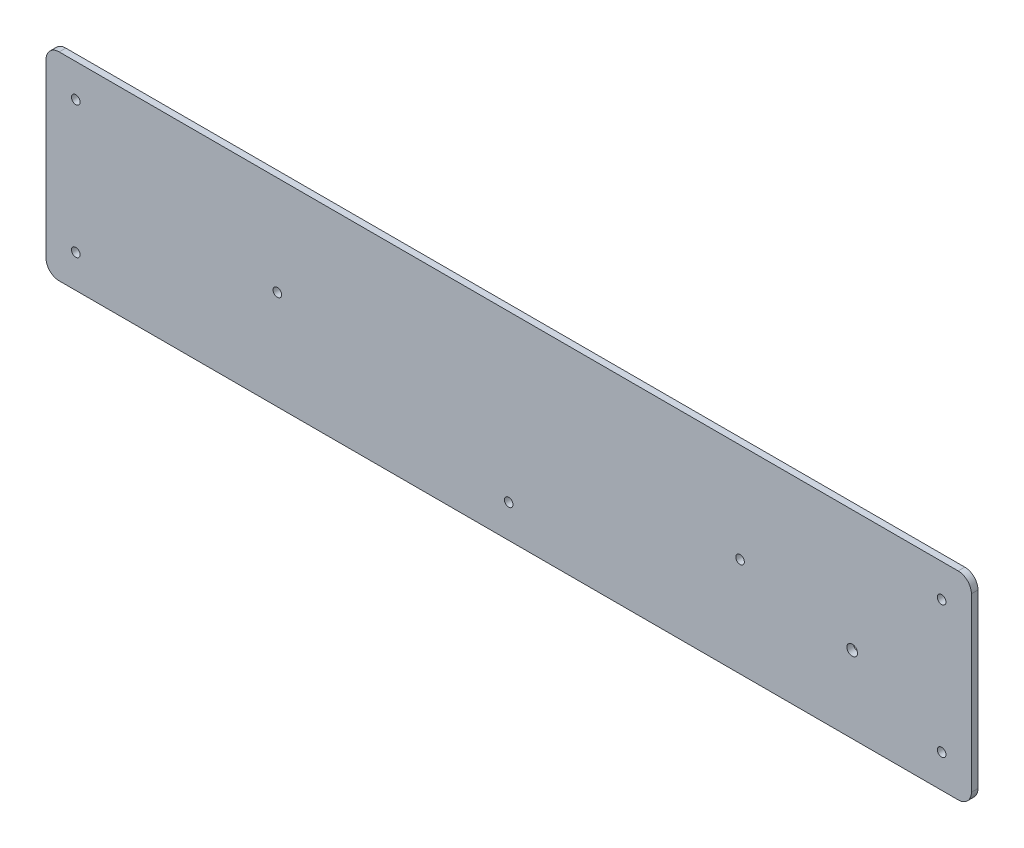
ISO-10303-21;
HEADER;
FILE_DESCRIPTION(('STEP AP214'),'2;1');
FILE_NAME('part.step','',(''),(''),'','','');
FILE_SCHEMA(('AUTOMOTIVE_DESIGN { 1 0 10303 214 1 1 1 1 }'));
ENDSEC;
DATA;
#1=APPLICATION_CONTEXT('core data for automotive mechanical design processes');
#2=APPLICATION_PROTOCOL_DEFINITION('international standard','automotive_design',2000,#1);
#3=PRODUCT_CONTEXT('',#1,'mechanical');
#4=PRODUCT('Part','Part','',(#3));
#5=PRODUCT_RELATED_PRODUCT_CATEGORY('part','',(#4));
#6=PRODUCT_DEFINITION_FORMATION('','',#4);
#7=PRODUCT_DEFINITION_CONTEXT('part definition',#1,'design');
#8=PRODUCT_DEFINITION('design','',#6,#7);
#9=PRODUCT_DEFINITION_SHAPE('','',#8);
#10=(LENGTH_UNIT() NAMED_UNIT(*) SI_UNIT(.MILLI.,.METRE.));
#11=(NAMED_UNIT(*) PLANE_ANGLE_UNIT() SI_UNIT($,.RADIAN.));
#12=(NAMED_UNIT(*) SI_UNIT($,.STERADIAN.) SOLID_ANGLE_UNIT());
#13=UNCERTAINTY_MEASURE_WITH_UNIT(LENGTH_MEASURE(1.E-05),#10,'distance_accuracy_value','');
#14=(GEOMETRIC_REPRESENTATION_CONTEXT(3) GLOBAL_UNCERTAINTY_ASSIGNED_CONTEXT((#13)) GLOBAL_UNIT_ASSIGNED_CONTEXT((#10,
#11,#12)) REPRESENTATION_CONTEXT('',''));
#15=CARTESIAN_POINT('',(0.,0.,0.));
#16=DIRECTION('',(0.,0.,1.));
#17=DIRECTION('',(1.,0.,0.));
#18=AXIS2_PLACEMENT_3D('',#15,#16,#17);
#19=CARTESIAN_POINT('',(350.,75.,5.));
#20=DIRECTION('',(-1.,0.,0.));
#21=DIRECTION('',(0.,0.,1.));
#22=AXIS2_PLACEMENT_3D('',#19,#20,#21);
#23=PLANE('',#22);
#24=DIRECTION('',(0.,1.,0.));
#25=VECTOR('',#24,1.);
#26=CARTESIAN_POINT('',(350.,75.,5.));
#27=LINE('',#26,#25);
#28=CARTESIAN_POINT('',(350.,-65.0000000000001,5.));
#29=VERTEX_POINT('',#28);
#30=CARTESIAN_POINT('',(350.,65.,5.));
#31=VERTEX_POINT('',#30);
#32=EDGE_CURVE('E135',#29,#31,#27,.T.);
#33=ORIENTED_EDGE('',*,*,#32,.F.);
#34=DIRECTION('',(0.,0.,-1.));
#35=VECTOR('',#34,1.);
#36=CARTESIAN_POINT('',(350.,-65.0000000000001,5.));
#37=LINE('',#36,#35);
#38=CARTESIAN_POINT('',(350.,-65.0000000000001,0.));
#39=VERTEX_POINT('',#38);
#40=EDGE_CURVE('E11',#29,#39,#37,.T.);
#41=ORIENTED_EDGE('',*,*,#40,.T.);
#42=DIRECTION('',(0.,1.,0.));
#43=VECTOR('',#42,1.);
#44=CARTESIAN_POINT('',(350.,75.,0.));
#45=LINE('',#44,#43);
#46=CARTESIAN_POINT('',(350.,65.,0.));
#47=VERTEX_POINT('',#46);
#48=EDGE_CURVE('E183',#39,#47,#45,.T.);
#49=ORIENTED_EDGE('',*,*,#48,.T.);
#50=DIRECTION('',(0.,0.,-1.));
#51=VECTOR('',#50,1.);
#52=CARTESIAN_POINT('',(350.,65.,5.));
#53=LINE('',#52,#51);
#54=EDGE_CURVE('E48',#47,#31,#53,.F.);
#55=ORIENTED_EDGE('',*,*,#54,.T.);
#56=EDGE_LOOP('',(#33,#41,#49,#55));
#57=FACE_BOUND('',#56,.T.);
#58=ADVANCED_FACE('F39',(#57),#23,.F.);
#59=CARTESIAN_POINT('',(-350.,75.,5.));
#60=DIRECTION('',(0.,-1.,0.));
#61=DIRECTION('',(0.,0.,-1.));
#62=AXIS2_PLACEMENT_3D('',#59,#60,#61);
#63=PLANE('',#62);
#64=DIRECTION('',(-1.,0.,0.));
#65=VECTOR('',#64,1.);
#66=CARTESIAN_POINT('',(-350.,75.,0.));
#67=LINE('',#66,#65);
#68=CARTESIAN_POINT('',(340.,75.,0.));
#69=VERTEX_POINT('',#68);
#70=CARTESIAN_POINT('',(-340.,75.,0.));
#71=VERTEX_POINT('',#70);
#72=EDGE_CURVE('E140',#69,#71,#67,.T.);
#73=ORIENTED_EDGE('',*,*,#72,.T.);
#74=DIRECTION('',(0.,0.,-1.));
#75=VECTOR('',#74,1.);
#76=CARTESIAN_POINT('',(-340.,75.,5.));
#77=LINE('',#76,#75);
#78=CARTESIAN_POINT('',(-340.,75.,5.));
#79=VERTEX_POINT('',#78);
#80=EDGE_CURVE('E56',#71,#79,#77,.F.);
#81=ORIENTED_EDGE('',*,*,#80,.T.);
#82=DIRECTION('',(-1.,0.,0.));
#83=VECTOR('',#82,1.);
#84=CARTESIAN_POINT('',(-350.,75.,5.));
#85=LINE('',#84,#83);
#86=CARTESIAN_POINT('',(340.,75.,5.));
#87=VERTEX_POINT('',#86);
#88=EDGE_CURVE('E138',#87,#79,#85,.T.);
#89=ORIENTED_EDGE('',*,*,#88,.F.);
#90=DIRECTION('',(0.,0.,-1.));
#91=VECTOR('',#90,1.);
#92=CARTESIAN_POINT('',(340.,75.,5.));
#93=LINE('',#92,#91);
#94=EDGE_CURVE('E158',#87,#69,#93,.T.);
#95=ORIENTED_EDGE('',*,*,#94,.T.);
#96=EDGE_LOOP('',(#73,#81,#89,#95));
#97=FACE_BOUND('',#96,.T.);
#98=ADVANCED_FACE('F237',(#97),#63,.F.);
#99=CARTESIAN_POINT('',(-350.,75.,5.));
#100=DIRECTION('',(1.,0.,0.));
#101=DIRECTION('',(0.,0.,-1.));
#102=AXIS2_PLACEMENT_3D('',#99,#100,#101);
#103=PLANE('',#102);
#104=DIRECTION('',(0.,-1.,0.));
#105=VECTOR('',#104,1.);
#106=CARTESIAN_POINT('',(-350.,75.,0.));
#107=LINE('',#106,#105);
#108=CARTESIAN_POINT('',(-350.,65.,0.));
#109=VERTEX_POINT('',#108);
#110=CARTESIAN_POINT('',(-350.,-65.0000000000001,0.));
#111=VERTEX_POINT('',#110);
#112=EDGE_CURVE('E136',#109,#111,#107,.T.);
#113=ORIENTED_EDGE('',*,*,#112,.T.);
#114=DIRECTION('',(0.,0.,-1.));
#115=VECTOR('',#114,1.);
#116=CARTESIAN_POINT('',(-350.,-65.0000000000001,5.));
#117=LINE('',#116,#115);
#118=CARTESIAN_POINT('',(-350.,-65.0000000000001,5.));
#119=VERTEX_POINT('',#118);
#120=EDGE_CURVE('E113',#111,#119,#117,.F.);
#121=ORIENTED_EDGE('',*,*,#120,.T.);
#122=DIRECTION('',(0.,-1.,0.));
#123=VECTOR('',#122,1.);
#124=CARTESIAN_POINT('',(-350.,75.,5.));
#125=LINE('',#124,#123);
#126=CARTESIAN_POINT('',(-350.,65.,5.));
#127=VERTEX_POINT('',#126);
#128=EDGE_CURVE('E192',#127,#119,#125,.T.);
#129=ORIENTED_EDGE('',*,*,#128,.F.);
#130=DIRECTION('',(0.,0.,-1.));
#131=VECTOR('',#130,1.);
#132=CARTESIAN_POINT('',(-350.,65.,5.));
#133=LINE('',#132,#131);
#134=EDGE_CURVE('E118',#127,#109,#133,.T.);
#135=ORIENTED_EDGE('',*,*,#134,.T.);
#136=EDGE_LOOP('',(#113,#121,#129,#135));
#137=FACE_BOUND('',#136,.T.);
#138=ADVANCED_FACE('F242',(#137),#103,.F.);
#139=CARTESIAN_POINT('',(-350.,-75.,5.));
#140=DIRECTION('',(0.,1.,0.));
#141=DIRECTION('',(0.,0.,1.));
#142=AXIS2_PLACEMENT_3D('',#139,#140,#141);
#143=PLANE('',#142);
#144=DIRECTION('',(1.,0.,0.));
#145=VECTOR('',#144,1.);
#146=CARTESIAN_POINT('',(-350.,-75.,5.));
#147=LINE('',#146,#145);
#148=CARTESIAN_POINT('',(-340.,-75.,5.));
#149=VERTEX_POINT('',#148);
#150=CARTESIAN_POINT('',(340.,-75.,5.));
#151=VERTEX_POINT('',#150);
#152=EDGE_CURVE('E128',#149,#151,#147,.T.);
#153=ORIENTED_EDGE('',*,*,#152,.F.);
#154=DIRECTION('',(0.,0.,-1.));
#155=VECTOR('',#154,1.);
#156=CARTESIAN_POINT('',(-340.,-75.,5.));
#157=LINE('',#156,#155);
#158=CARTESIAN_POINT('',(-340.,-75.,0.));
#159=VERTEX_POINT('',#158);
#160=EDGE_CURVE('E112',#149,#159,#157,.T.);
#161=ORIENTED_EDGE('',*,*,#160,.T.);
#162=DIRECTION('',(1.,0.,0.));
#163=VECTOR('',#162,1.);
#164=CARTESIAN_POINT('',(-350.,-75.,0.));
#165=LINE('',#164,#163);
#166=CARTESIAN_POINT('',(340.,-75.,0.));
#167=VERTEX_POINT('',#166);
#168=EDGE_CURVE('E125',#159,#167,#165,.T.);
#169=ORIENTED_EDGE('',*,*,#168,.T.);
#170=DIRECTION('',(0.,0.,-1.));
#171=VECTOR('',#170,1.);
#172=CARTESIAN_POINT('',(340.,-75.,5.));
#173=LINE('',#172,#171);
#174=EDGE_CURVE('E130',#167,#151,#173,.F.);
#175=ORIENTED_EDGE('',*,*,#174,.T.);
#176=EDGE_LOOP('',(#153,#161,#169,#175));
#177=FACE_BOUND('',#176,.T.);
#178=ADVANCED_FACE('F124',(#177),#143,.F.);
#179=CARTESIAN_POINT('',(0.,0.,5.));
#180=DIRECTION('',(0.,0.,1.));
#181=DIRECTION('',(1.,0.,0.));
#182=AXIS2_PLACEMENT_3D('',#179,#180,#181);
#183=PLANE('',#182);
#184=CARTESIAN_POINT('',(259.827830126626,-16.9623613724783,5.));
#185=DIRECTION('',(0.,0.,1.));
#186=DIRECTION('',(1.,0.,0.));
#187=AXIS2_PLACEMENT_3D('',#184,#185,#186);
#188=CIRCLE('',#187,4.00000000008923);
#189=CARTESIAN_POINT('',(263.827830126716,-16.9623613724783,5.));
#190=VERTEX_POINT('',#189);
#191=EDGE_CURVE('E216',#190,#190,#188,.T.);
#192=ORIENTED_EDGE('',*,*,#191,.F.);
#193=EDGE_LOOP('',(#192));
#194=FACE_BOUND('',#193,.T.);
#195=CARTESIAN_POINT('',(-327.483802203545,-50.,5.));
#196=DIRECTION('',(0.,0.,1.));
#197=DIRECTION('',(1.,0.,0.));
#198=AXIS2_PLACEMENT_3D('',#195,#196,#197);
#199=CIRCLE('',#198,3.24999999999995);
#200=CARTESIAN_POINT('',(-324.233802203545,-50.,5.));
#201=VERTEX_POINT('',#200);
#202=EDGE_CURVE('E198',#201,#201,#199,.T.);
#203=ORIENTED_EDGE('',*,*,#202,.F.);
#204=EDGE_LOOP('',(#203));
#205=FACE_BOUND('',#204,.T.);
#206=CARTESIAN_POINT('',(327.483802203545,-50.,5.));
#207=DIRECTION('',(0.,0.,1.));
#208=DIRECTION('',(-1.,0.,0.));
#209=AXIS2_PLACEMENT_3D('',#206,#207,#208);
#210=CIRCLE('',#209,3.24999999999995);
#211=CARTESIAN_POINT('',(324.233802203545,-50.,5.));
#212=VERTEX_POINT('',#211);
#213=EDGE_CURVE('E206',#212,#212,#210,.T.);
#214=ORIENTED_EDGE('',*,*,#213,.F.);
#215=EDGE_LOOP('',(#214));
#216=FACE_BOUND('',#215,.T.);
#217=CARTESIAN_POINT('',(-327.483802203545,50.,5.));
#218=DIRECTION('',(0.,0.,1.));
#219=DIRECTION('',(-1.,0.,0.));
#220=AXIS2_PLACEMENT_3D('',#217,#218,#219);
#221=CIRCLE('',#220,3.24999999999995);
#222=CARTESIAN_POINT('',(-330.733802203545,50.,5.));
#223=VERTEX_POINT('',#222);
#224=EDGE_CURVE('E202',#223,#223,#221,.T.);
#225=ORIENTED_EDGE('',*,*,#224,.F.);
#226=EDGE_LOOP('',(#225));
#227=FACE_BOUND('',#226,.T.);
#228=CARTESIAN_POINT('',(175.,0.,5.));
#229=DIRECTION('',(0.,0.,1.));
#230=DIRECTION('',(-1.,0.,0.));
#231=AXIS2_PLACEMENT_3D('',#228,#229,#230);
#232=CIRCLE('',#231,3.25000000000001);
#233=CARTESIAN_POINT('',(171.75,0.,5.));
#234=VERTEX_POINT('',#233);
#235=EDGE_CURVE('E199',#234,#234,#232,.T.);
#236=ORIENTED_EDGE('',*,*,#235,.F.);
#237=EDGE_LOOP('',(#236));
#238=FACE_BOUND('',#237,.T.);
#239=CARTESIAN_POINT('',(-175.,0.,5.));
#240=DIRECTION('',(0.,0.,1.));
#241=DIRECTION('',(1.,0.,0.));
#242=AXIS2_PLACEMENT_3D('',#239,#240,#241);
#243=CIRCLE('',#242,3.25000000000001);
#244=CARTESIAN_POINT('',(-171.75,0.,5.));
#245=VERTEX_POINT('',#244);
#246=EDGE_CURVE('E203',#245,#245,#243,.T.);
#247=ORIENTED_EDGE('',*,*,#246,.F.);
#248=EDGE_LOOP('',(#247));
#249=FACE_BOUND('',#248,.T.);
#250=CARTESIAN_POINT('',(327.483802203545,50.,5.));
#251=DIRECTION('',(0.,0.,1.));
#252=DIRECTION('',(1.,0.,0.));
#253=AXIS2_PLACEMENT_3D('',#250,#251,#252);
#254=CIRCLE('',#253,3.24999999999995);
#255=CARTESIAN_POINT('',(330.733802203545,50.,5.));
#256=VERTEX_POINT('',#255);
#257=EDGE_CURVE('E211',#256,#256,#254,.T.);
#258=ORIENTED_EDGE('',*,*,#257,.F.);
#259=EDGE_LOOP('',(#258));
#260=FACE_BOUND('',#259,.T.);
#261=CARTESIAN_POINT('',(-2.22044604925031E-13,-50.,5.));
#262=DIRECTION('',(0.,0.,1.));
#263=DIRECTION('',(1.,0.,0.));
#264=AXIS2_PLACEMENT_3D('',#261,#262,#263);
#265=CIRCLE('',#264,3.25);
#266=CARTESIAN_POINT('',(3.24999999999978,-50.,5.));
#267=VERTEX_POINT('',#266);
#268=EDGE_CURVE('E167',#267,#267,#265,.T.);
#269=ORIENTED_EDGE('',*,*,#268,.F.);
#270=EDGE_LOOP('',(#269));
#271=FACE_BOUND('',#270,.T.);
#272=ORIENTED_EDGE('',*,*,#128,.T.);
#273=CARTESIAN_POINT('',(-340.,-65.,5.));
#274=DIRECTION('',(0.,0.,1.));
#275=DIRECTION('',(1.,0.,0.));
#276=AXIS2_PLACEMENT_3D('',#273,#274,#275);
#277=CIRCLE('',#276,10.);
#278=EDGE_CURVE('E156',#119,#149,#277,.T.);
#279=ORIENTED_EDGE('',*,*,#278,.T.);
#280=ORIENTED_EDGE('',*,*,#152,.T.);
#281=CARTESIAN_POINT('',(340.,-65.0000000000001,5.));
#282=DIRECTION('',(0.,0.,1.));
#283=DIRECTION('',(1.,0.,0.));
#284=AXIS2_PLACEMENT_3D('',#281,#282,#283);
#285=CIRCLE('',#284,10.);
#286=EDGE_CURVE('E152',#151,#29,#285,.T.);
#287=ORIENTED_EDGE('',*,*,#286,.T.);
#288=ORIENTED_EDGE('',*,*,#32,.T.);
#289=CARTESIAN_POINT('',(340.,65.,5.));
#290=DIRECTION('',(0.,0.,1.));
#291=DIRECTION('',(1.,0.,0.));
#292=AXIS2_PLACEMENT_3D('',#289,#290,#291);
#293=CIRCLE('',#292,10.);
#294=EDGE_CURVE('E63',#31,#87,#293,.T.);
#295=ORIENTED_EDGE('',*,*,#294,.T.);
#296=ORIENTED_EDGE('',*,*,#88,.T.);
#297=CARTESIAN_POINT('',(-340.,65.,5.));
#298=DIRECTION('',(0.,0.,1.));
#299=DIRECTION('',(1.,0.,0.));
#300=AXIS2_PLACEMENT_3D('',#297,#298,#299);
#301=CIRCLE('',#300,10.);
#302=EDGE_CURVE('E154',#79,#127,#301,.T.);
#303=ORIENTED_EDGE('',*,*,#302,.T.);
#304=EDGE_LOOP('',(#272,#279,#280,#287,#288,#295,#296,#303));
#305=FACE_BOUND('',#304,.T.);
#306=ADVANCED_FACE('F262',(#194,#205,#216,#227,#238,#249,#260,#271,#305),#183,.T.);
#307=CARTESIAN_POINT('',(0.,0.,0.));
#308=DIRECTION('',(0.,0.,1.));
#309=DIRECTION('',(1.,0.,0.));
#310=AXIS2_PLACEMENT_3D('',#307,#308,#309);
#311=PLANE('',#310);
#312=CARTESIAN_POINT('',(259.827830126626,-16.9623613724783,0.));
#313=DIRECTION('',(0.,0.,1.));
#314=DIRECTION('',(1.,0.,0.));
#315=AXIS2_PLACEMENT_3D('',#312,#313,#314);
#316=CIRCLE('',#315,4.00000000008923);
#317=CARTESIAN_POINT('',(263.827830126716,-16.9623613724783,0.));
#318=VERTEX_POINT('',#317);
#319=EDGE_CURVE('E43',#318,#318,#316,.T.);
#320=ORIENTED_EDGE('',*,*,#319,.T.);
#321=EDGE_LOOP('',(#320));
#322=FACE_BOUND('',#321,.T.);
#323=CARTESIAN_POINT('',(-327.483802203545,-50.,0.));
#324=DIRECTION('',(0.,0.,1.));
#325=DIRECTION('',(1.,0.,0.));
#326=AXIS2_PLACEMENT_3D('',#323,#324,#325);
#327=CIRCLE('',#326,3.24999999999995);
#328=CARTESIAN_POINT('',(-324.233802203545,-50.,0.));
#329=VERTEX_POINT('',#328);
#330=EDGE_CURVE('E181',#329,#329,#327,.T.);
#331=ORIENTED_EDGE('',*,*,#330,.T.);
#332=EDGE_LOOP('',(#331));
#333=FACE_BOUND('',#332,.T.);
#334=CARTESIAN_POINT('',(327.483802203545,-50.,0.));
#335=DIRECTION('',(0.,0.,1.));
#336=DIRECTION('',(1.,0.,0.));
#337=AXIS2_PLACEMENT_3D('',#334,#335,#336);
#338=CIRCLE('',#337,3.24999999999995);
#339=CARTESIAN_POINT('',(330.733802203545,-50.,0.));
#340=VERTEX_POINT('',#339);
#341=EDGE_CURVE('E179',#340,#340,#338,.T.);
#342=ORIENTED_EDGE('',*,*,#341,.T.);
#343=EDGE_LOOP('',(#342));
#344=FACE_BOUND('',#343,.T.);
#345=CARTESIAN_POINT('',(-327.483802203545,50.,0.));
#346=DIRECTION('',(0.,0.,1.));
#347=DIRECTION('',(1.,0.,0.));
#348=AXIS2_PLACEMENT_3D('',#345,#346,#347);
#349=CIRCLE('',#348,3.24999999999995);
#350=CARTESIAN_POINT('',(-324.233802203545,50.,0.));
#351=VERTEX_POINT('',#350);
#352=EDGE_CURVE('E176',#351,#351,#349,.T.);
#353=ORIENTED_EDGE('',*,*,#352,.T.);
#354=EDGE_LOOP('',(#353));
#355=FACE_BOUND('',#354,.T.);
#356=CARTESIAN_POINT('',(175.,0.,0.));
#357=DIRECTION('',(0.,0.,1.));
#358=DIRECTION('',(1.,0.,0.));
#359=AXIS2_PLACEMENT_3D('',#356,#357,#358);
#360=CIRCLE('',#359,3.25000000000001);
#361=CARTESIAN_POINT('',(178.25,0.,0.));
#362=VERTEX_POINT('',#361);
#363=EDGE_CURVE('E173',#362,#362,#360,.T.);
#364=ORIENTED_EDGE('',*,*,#363,.T.);
#365=EDGE_LOOP('',(#364));
#366=FACE_BOUND('',#365,.T.);
#367=CARTESIAN_POINT('',(-175.,0.,0.));
#368=DIRECTION('',(0.,0.,1.));
#369=DIRECTION('',(1.,0.,0.));
#370=AXIS2_PLACEMENT_3D('',#367,#368,#369);
#371=CIRCLE('',#370,3.25000000000001);
#372=CARTESIAN_POINT('',(-171.75,0.,0.));
#373=VERTEX_POINT('',#372);
#374=EDGE_CURVE('E170',#373,#373,#371,.T.);
#375=ORIENTED_EDGE('',*,*,#374,.T.);
#376=EDGE_LOOP('',(#375));
#377=FACE_BOUND('',#376,.T.);
#378=CARTESIAN_POINT('',(327.483802203545,50.,0.));
#379=DIRECTION('',(0.,0.,1.));
#380=DIRECTION('',(1.,0.,0.));
#381=AXIS2_PLACEMENT_3D('',#378,#379,#380);
#382=CIRCLE('',#381,3.24999999999995);
#383=CARTESIAN_POINT('',(330.733802203545,50.,0.));
#384=VERTEX_POINT('',#383);
#385=EDGE_CURVE('E166',#384,#384,#382,.T.);
#386=ORIENTED_EDGE('',*,*,#385,.T.);
#387=EDGE_LOOP('',(#386));
#388=FACE_BOUND('',#387,.T.);
#389=CARTESIAN_POINT('',(-2.22044604925031E-13,-50.,0.));
#390=DIRECTION('',(0.,0.,1.));
#391=DIRECTION('',(1.,0.,0.));
#392=AXIS2_PLACEMENT_3D('',#389,#390,#391);
#393=CIRCLE('',#392,3.25);
#394=CARTESIAN_POINT('',(3.24999999999978,-50.,0.));
#395=VERTEX_POINT('',#394);
#396=EDGE_CURVE('E163',#395,#395,#393,.T.);
#397=ORIENTED_EDGE('',*,*,#396,.T.);
#398=EDGE_LOOP('',(#397));
#399=FACE_BOUND('',#398,.T.);
#400=ORIENTED_EDGE('',*,*,#168,.F.);
#401=CARTESIAN_POINT('',(-340.,-65.,0.));
#402=DIRECTION('',(0.,0.,1.));
#403=DIRECTION('',(1.,0.,0.));
#404=AXIS2_PLACEMENT_3D('',#401,#402,#403);
#405=CIRCLE('',#404,10.);
#406=EDGE_CURVE('E108',#159,#111,#405,.F.);
#407=ORIENTED_EDGE('',*,*,#406,.T.);
#408=ORIENTED_EDGE('',*,*,#112,.F.);
#409=CARTESIAN_POINT('',(-340.,65.,0.));
#410=DIRECTION('',(0.,0.,1.));
#411=DIRECTION('',(1.,0.,0.));
#412=AXIS2_PLACEMENT_3D('',#409,#410,#411);
#413=CIRCLE('',#412,10.);
#414=EDGE_CURVE('E119',#109,#71,#413,.F.);
#415=ORIENTED_EDGE('',*,*,#414,.T.);
#416=ORIENTED_EDGE('',*,*,#72,.F.);
#417=CARTESIAN_POINT('',(340.,65.,0.));
#418=DIRECTION('',(0.,0.,1.));
#419=DIRECTION('',(1.,0.,0.));
#420=AXIS2_PLACEMENT_3D('',#417,#418,#419);
#421=CIRCLE('',#420,10.);
#422=EDGE_CURVE('E129',#69,#47,#421,.F.);
#423=ORIENTED_EDGE('',*,*,#422,.T.);
#424=ORIENTED_EDGE('',*,*,#48,.F.);
#425=CARTESIAN_POINT('',(340.,-65.0000000000001,0.));
#426=DIRECTION('',(0.,0.,1.));
#427=DIRECTION('',(1.,0.,0.));
#428=AXIS2_PLACEMENT_3D('',#425,#426,#427);
#429=CIRCLE('',#428,10.);
#430=EDGE_CURVE('E134',#39,#167,#429,.F.);
#431=ORIENTED_EDGE('',*,*,#430,.T.);
#432=EDGE_LOOP('',(#400,#407,#408,#415,#416,#423,#424,#431));
#433=FACE_BOUND('',#432,.T.);
#434=ADVANCED_FACE('F132',(#322,#333,#344,#355,#366,#377,#388,#399,#433),#311,.F.);
#435=CARTESIAN_POINT('',(-340.,-65.,5.));
#436=DIRECTION('',(0.,0.,-1.));
#437=DIRECTION('',(-1.,0.,0.));
#438=AXIS2_PLACEMENT_3D('',#435,#436,#437);
#439=CYLINDRICAL_SURFACE('',#438,10.);
#440=ORIENTED_EDGE('',*,*,#278,.F.);
#441=ORIENTED_EDGE('',*,*,#120,.F.);
#442=ORIENTED_EDGE('',*,*,#406,.F.);
#443=ORIENTED_EDGE('',*,*,#160,.F.);
#444=EDGE_LOOP('',(#440,#441,#442,#443));
#445=FACE_BOUND('',#444,.T.);
#446=ADVANCED_FACE('F111',(#445),#439,.T.);
#447=CARTESIAN_POINT('',(-340.,65.,5.));
#448=DIRECTION('',(0.,0.,-1.));
#449=DIRECTION('',(-1.,0.,0.));
#450=AXIS2_PLACEMENT_3D('',#447,#448,#449);
#451=CYLINDRICAL_SURFACE('',#450,10.);
#452=ORIENTED_EDGE('',*,*,#302,.F.);
#453=ORIENTED_EDGE('',*,*,#80,.F.);
#454=ORIENTED_EDGE('',*,*,#414,.F.);
#455=ORIENTED_EDGE('',*,*,#134,.F.);
#456=EDGE_LOOP('',(#452,#453,#454,#455));
#457=FACE_BOUND('',#456,.T.);
#458=ADVANCED_FACE('F249',(#457),#451,.T.);
#459=CARTESIAN_POINT('',(340.,-65.0000000000001,5.));
#460=DIRECTION('',(0.,0.,-1.));
#461=DIRECTION('',(-1.,0.,0.));
#462=AXIS2_PLACEMENT_3D('',#459,#460,#461);
#463=CYLINDRICAL_SURFACE('',#462,10.);
#464=ORIENTED_EDGE('',*,*,#286,.F.);
#465=ORIENTED_EDGE('',*,*,#174,.F.);
#466=ORIENTED_EDGE('',*,*,#430,.F.);
#467=ORIENTED_EDGE('',*,*,#40,.F.);
#468=EDGE_LOOP('',(#464,#465,#466,#467));
#469=FACE_BOUND('',#468,.T.);
#470=ADVANCED_FACE('F251',(#469),#463,.T.);
#471=CARTESIAN_POINT('',(340.,65.,5.));
#472=DIRECTION('',(0.,0.,-1.));
#473=DIRECTION('',(-1.,0.,0.));
#474=AXIS2_PLACEMENT_3D('',#471,#472,#473);
#475=CYLINDRICAL_SURFACE('',#474,10.);
#476=ORIENTED_EDGE('',*,*,#294,.F.);
#477=ORIENTED_EDGE('',*,*,#54,.F.);
#478=ORIENTED_EDGE('',*,*,#422,.F.);
#479=ORIENTED_EDGE('',*,*,#94,.F.);
#480=EDGE_LOOP('',(#476,#477,#478,#479));
#481=FACE_BOUND('',#480,.T.);
#482=ADVANCED_FACE('F41',(#481),#475,.T.);
#483=CARTESIAN_POINT('',(-2.22044604925031E-13,-50.,-265.));
#484=DIRECTION('',(0.,0.,1.));
#485=DIRECTION('',(1.,0.,0.));
#486=AXIS2_PLACEMENT_3D('',#483,#484,#485);
#487=CYLINDRICAL_SURFACE('',#486,3.25);
#488=ORIENTED_EDGE('',*,*,#268,.T.);
#489=EDGE_LOOP('',(#488));
#490=FACE_BOUND('',#489,.T.);
#491=ORIENTED_EDGE('',*,*,#396,.F.);
#492=EDGE_LOOP('',(#491));
#493=FACE_BOUND('',#492,.T.);
#494=ADVANCED_FACE('F258',(#490,#493),#487,.F.);
#495=CARTESIAN_POINT('',(327.483802203545,50.,-265.));
#496=DIRECTION('',(0.,0.,1.));
#497=DIRECTION('',(1.,0.,0.));
#498=AXIS2_PLACEMENT_3D('',#495,#496,#497);
#499=CYLINDRICAL_SURFACE('',#498,3.24999999999995);
#500=ORIENTED_EDGE('',*,*,#257,.T.);
#501=EDGE_LOOP('',(#500));
#502=FACE_BOUND('',#501,.T.);
#503=ORIENTED_EDGE('',*,*,#385,.F.);
#504=EDGE_LOOP('',(#503));
#505=FACE_BOUND('',#504,.T.);
#506=ADVANCED_FACE('F282',(#502,#505),#499,.F.);
#507=CARTESIAN_POINT('',(-175.,0.,-265.));
#508=DIRECTION('',(0.,0.,1.));
#509=DIRECTION('',(1.,0.,0.));
#510=AXIS2_PLACEMENT_3D('',#507,#508,#509);
#511=CYLINDRICAL_SURFACE('',#510,3.25000000000001);
#512=ORIENTED_EDGE('',*,*,#246,.T.);
#513=EDGE_LOOP('',(#512));
#514=FACE_BOUND('',#513,.T.);
#515=ORIENTED_EDGE('',*,*,#374,.F.);
#516=EDGE_LOOP('',(#515));
#517=FACE_BOUND('',#516,.T.);
#518=ADVANCED_FACE('F288',(#514,#517),#511,.F.);
#519=CARTESIAN_POINT('',(175.,0.,-265.));
#520=DIRECTION('',(0.,0.,1.));
#521=DIRECTION('',(1.,0.,0.));
#522=AXIS2_PLACEMENT_3D('',#519,#520,#521);
#523=CYLINDRICAL_SURFACE('',#522,3.25000000000001);
#524=ORIENTED_EDGE('',*,*,#235,.T.);
#525=EDGE_LOOP('',(#524));
#526=FACE_BOUND('',#525,.T.);
#527=ORIENTED_EDGE('',*,*,#363,.F.);
#528=EDGE_LOOP('',(#527));
#529=FACE_BOUND('',#528,.T.);
#530=ADVANCED_FACE('F284',(#526,#529),#523,.F.);
#531=CARTESIAN_POINT('',(-327.483802203545,50.,-265.));
#532=DIRECTION('',(0.,0.,1.));
#533=DIRECTION('',(1.,0.,0.));
#534=AXIS2_PLACEMENT_3D('',#531,#532,#533);
#535=CYLINDRICAL_SURFACE('',#534,3.24999999999995);
#536=ORIENTED_EDGE('',*,*,#224,.T.);
#537=EDGE_LOOP('',(#536));
#538=FACE_BOUND('',#537,.T.);
#539=ORIENTED_EDGE('',*,*,#352,.F.);
#540=EDGE_LOOP('',(#539));
#541=FACE_BOUND('',#540,.T.);
#542=ADVANCED_FACE('F287',(#538,#541),#535,.F.);
#543=CARTESIAN_POINT('',(327.483802203545,-50.,-265.));
#544=DIRECTION('',(0.,0.,1.));
#545=DIRECTION('',(1.,0.,0.));
#546=AXIS2_PLACEMENT_3D('',#543,#544,#545);
#547=CYLINDRICAL_SURFACE('',#546,3.24999999999995);
#548=ORIENTED_EDGE('',*,*,#213,.T.);
#549=EDGE_LOOP('',(#548));
#550=FACE_BOUND('',#549,.T.);
#551=ORIENTED_EDGE('',*,*,#341,.F.);
#552=EDGE_LOOP('',(#551));
#553=FACE_BOUND('',#552,.T.);
#554=ADVANCED_FACE('F232',(#550,#553),#547,.F.);
#555=CARTESIAN_POINT('',(-327.483802203545,-50.,-265.));
#556=DIRECTION('',(0.,0.,1.));
#557=DIRECTION('',(1.,0.,0.));
#558=AXIS2_PLACEMENT_3D('',#555,#556,#557);
#559=CYLINDRICAL_SURFACE('',#558,3.24999999999995);
#560=ORIENTED_EDGE('',*,*,#202,.T.);
#561=EDGE_LOOP('',(#560));
#562=FACE_BOUND('',#561,.T.);
#563=ORIENTED_EDGE('',*,*,#330,.F.);
#564=EDGE_LOOP('',(#563));
#565=FACE_BOUND('',#564,.T.);
#566=ADVANCED_FACE('F226',(#562,#565),#559,.F.);
#567=CARTESIAN_POINT('',(259.827830126626,-16.9623613724783,-15.));
#568=DIRECTION('',(0.,0.,1.));
#569=DIRECTION('',(1.,0.,0.));
#570=AXIS2_PLACEMENT_3D('',#567,#568,#569);
#571=CYLINDRICAL_SURFACE('',#570,4.00000000008923);
#572=ORIENTED_EDGE('',*,*,#191,.T.);
#573=EDGE_LOOP('',(#572));
#574=FACE_BOUND('',#573,.T.);
#575=ORIENTED_EDGE('',*,*,#319,.F.);
#576=EDGE_LOOP('',(#575));
#577=FACE_BOUND('',#576,.T.);
#578=ADVANCED_FACE('F224',(#574,#577),#571,.F.);
#579=CLOSED_SHELL('',(#58,#98,#138,#178,#306,#434,#446,#458,#470,#482,#494,#506,#518,#530,#542,
#554,#566,#578));
#580=MANIFOLD_SOLID_BREP('B2',#579);
#581=ADVANCED_BREP_SHAPE_REPRESENTATION('',(#18,#580),#14);
#582=SHAPE_DEFINITION_REPRESENTATION(#9,#581);
ENDSEC;
END-ISO-10303-21;
